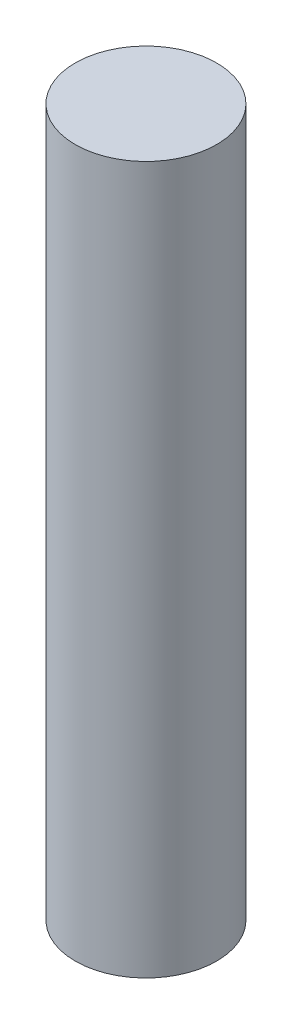
ISO-10303-21;
HEADER;
FILE_DESCRIPTION(('STEP AP214'),'2;1');
FILE_NAME('part.step','',(''),(''),'','','');
FILE_SCHEMA(('AUTOMOTIVE_DESIGN { 1 0 10303 214 1 1 1 1 }'));
ENDSEC;
DATA;
#1=APPLICATION_CONTEXT('core data for automotive mechanical design processes');
#2=APPLICATION_PROTOCOL_DEFINITION('international standard','automotive_design',2000,#1);
#3=PRODUCT_CONTEXT('',#1,'mechanical');
#4=PRODUCT('Part','Part','',(#3));
#5=PRODUCT_RELATED_PRODUCT_CATEGORY('part','',(#4));
#6=PRODUCT_DEFINITION_FORMATION('','',#4);
#7=PRODUCT_DEFINITION_CONTEXT('part definition',#1,'design');
#8=PRODUCT_DEFINITION('design','',#6,#7);
#9=PRODUCT_DEFINITION_SHAPE('','',#8);
#10=(LENGTH_UNIT() NAMED_UNIT(*) SI_UNIT(.MILLI.,.METRE.));
#11=(NAMED_UNIT(*) PLANE_ANGLE_UNIT() SI_UNIT($,.RADIAN.));
#12=(NAMED_UNIT(*) SI_UNIT($,.STERADIAN.) SOLID_ANGLE_UNIT());
#13=UNCERTAINTY_MEASURE_WITH_UNIT(LENGTH_MEASURE(1.E-05),#10,'distance_accuracy_value','');
#14=(GEOMETRIC_REPRESENTATION_CONTEXT(3) GLOBAL_UNCERTAINTY_ASSIGNED_CONTEXT((#13)) GLOBAL_UNIT_ASSIGNED_CONTEXT((#10,
#11,#12)) REPRESENTATION_CONTEXT('',''));
#15=CARTESIAN_POINT('',(0.,0.,0.));
#16=DIRECTION('',(0.,0.,1.));
#17=DIRECTION('',(1.,0.,0.));
#18=AXIS2_PLACEMENT_3D('',#15,#16,#17);
#19=CARTESIAN_POINT('',(0.,200.,0.));
#20=DIRECTION('',(0.,-1.,0.));
#21=DIRECTION('',(0.,0.,-1.));
#22=AXIS2_PLACEMENT_3D('',#19,#20,#21);
#23=CYLINDRICAL_SURFACE('',#22,20.);
#24=CARTESIAN_POINT('',(0.,200.,0.));
#25=DIRECTION('',(0.,1.,0.));
#26=DIRECTION('',(0.,0.,1.));
#27=AXIS2_PLACEMENT_3D('',#24,#25,#26);
#28=CIRCLE('',#27,20.);
#29=CARTESIAN_POINT('',(0.,200.,20.));
#30=VERTEX_POINT('',#29);
#31=EDGE_CURVE('E10',#30,#30,#28,.T.);
#32=ORIENTED_EDGE('',*,*,#31,.F.);
#33=EDGE_LOOP('',(#32));
#34=FACE_BOUND('',#33,.T.);
#35=CARTESIAN_POINT('',(0.,0.,0.));
#36=DIRECTION('',(0.,1.,0.));
#37=DIRECTION('',(0.,0.,1.));
#38=AXIS2_PLACEMENT_3D('',#35,#36,#37);
#39=CIRCLE('',#38,20.);
#40=CARTESIAN_POINT('',(0.,0.,20.));
#41=VERTEX_POINT('',#40);
#42=EDGE_CURVE('E33',#41,#41,#39,.T.);
#43=ORIENTED_EDGE('',*,*,#42,.T.);
#44=EDGE_LOOP('',(#43));
#45=FACE_BOUND('',#44,.T.);
#46=ADVANCED_FACE('F30',(#34,#45),#23,.T.);
#47=CARTESIAN_POINT('',(0.,200.,0.));
#48=DIRECTION('',(0.,1.,0.));
#49=DIRECTION('',(0.,0.,1.));
#50=AXIS2_PLACEMENT_3D('',#47,#48,#49);
#51=PLANE('',#50);
#52=ORIENTED_EDGE('',*,*,#31,.T.);
#53=EDGE_LOOP('',(#52));
#54=FACE_BOUND('',#53,.T.);
#55=ADVANCED_FACE('F45',(#54),#51,.T.);
#56=CARTESIAN_POINT('',(0.,0.,0.));
#57=DIRECTION('',(0.,1.,0.));
#58=DIRECTION('',(0.,0.,1.));
#59=AXIS2_PLACEMENT_3D('',#56,#57,#58);
#60=PLANE('',#59);
#61=ORIENTED_EDGE('',*,*,#42,.F.);
#62=EDGE_LOOP('',(#61));
#63=FACE_BOUND('',#62,.T.);
#64=ADVANCED_FACE('F43',(#63),#60,.F.);
#65=CLOSED_SHELL('',(#46,#55,#64));
#66=MANIFOLD_SOLID_BREP('B2',#65);
#67=ADVANCED_BREP_SHAPE_REPRESENTATION('',(#18,#66),#14);
#68=SHAPE_DEFINITION_REPRESENTATION(#9,#67);
ENDSEC;
END-ISO-10303-21;
